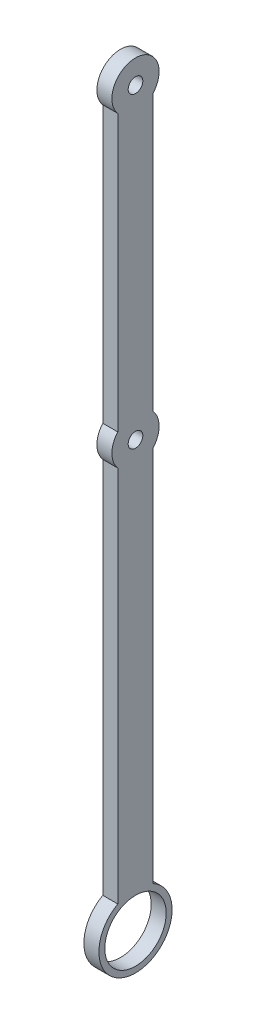
ISO-10303-21;
HEADER;
FILE_DESCRIPTION(('STEP AP214'),'2;1');
FILE_NAME('part.step','',(''),(''),'','','');
FILE_SCHEMA(('AUTOMOTIVE_DESIGN { 1 0 10303 214 1 1 1 1 }'));
ENDSEC;
DATA;
#1=APPLICATION_CONTEXT('core data for automotive mechanical design processes');
#2=APPLICATION_PROTOCOL_DEFINITION('international standard','automotive_design',2000,#1);
#3=PRODUCT_CONTEXT('',#1,'mechanical');
#4=PRODUCT('Part','Part','',(#3));
#5=PRODUCT_RELATED_PRODUCT_CATEGORY('part','',(#4));
#6=PRODUCT_DEFINITION_FORMATION('','',#4);
#7=PRODUCT_DEFINITION_CONTEXT('part definition',#1,'design');
#8=PRODUCT_DEFINITION('design','',#6,#7);
#9=PRODUCT_DEFINITION_SHAPE('','',#8);
#10=(LENGTH_UNIT() NAMED_UNIT(*) SI_UNIT(.MILLI.,.METRE.));
#11=(NAMED_UNIT(*) PLANE_ANGLE_UNIT() SI_UNIT($,.RADIAN.));
#12=(NAMED_UNIT(*) SI_UNIT($,.STERADIAN.) SOLID_ANGLE_UNIT());
#13=UNCERTAINTY_MEASURE_WITH_UNIT(LENGTH_MEASURE(1.E-05),#10,'distance_accuracy_value','');
#14=(GEOMETRIC_REPRESENTATION_CONTEXT(3) GLOBAL_UNCERTAINTY_ASSIGNED_CONTEXT((#13)) GLOBAL_UNIT_ASSIGNED_CONTEXT((#10,
#11,#12)) REPRESENTATION_CONTEXT('',''));
#15=CARTESIAN_POINT('',(0.,0.,0.));
#16=DIRECTION('',(0.,0.,1.));
#17=DIRECTION('',(1.,0.,0.));
#18=AXIS2_PLACEMENT_3D('',#15,#16,#17);
#19=CARTESIAN_POINT('',(3.175,-65.,0.));
#20=DIRECTION('',(1.,0.,0.));
#21=DIRECTION('',(0.,0.,-1.));
#22=AXIS2_PLACEMENT_3D('',#19,#20,#21);
#23=PLANE('',#22);
#24=CARTESIAN_POINT('',(3.175,-65.,0.));
#25=DIRECTION('',(1.,0.,0.));
#26=DIRECTION('',(0.,0.,-1.));
#27=AXIS2_PLACEMENT_3D('',#24,#25,#26);
#28=CIRCLE('',#27,1.55000000000003);
#29=CARTESIAN_POINT('',(3.175,-65.,-1.55000000000003));
#30=VERTEX_POINT('',#29);
#31=EDGE_CURVE('E213',#30,#30,#28,.T.);
#32=ORIENTED_EDGE('',*,*,#31,.F.);
#33=EDGE_LOOP('',(#32));
#34=FACE_BOUND('',#33,.T.);
#35=CARTESIAN_POINT('',(3.175,-65.,0.));
#36=DIRECTION('',(1.,0.,0.));
#37=DIRECTION('',(0.,0.,-1.));
#38=AXIS2_PLACEMENT_3D('',#35,#36,#37);
#39=CIRCLE('',#38,5.);
#40=CARTESIAN_POINT('',(3.175,-61.6928108611693,3.75000000000001));
#41=VERTEX_POINT('',#40);
#42=CARTESIAN_POINT('',(3.175,-68.3071891388307,3.75000000000001));
#43=VERTEX_POINT('',#42);
#44=EDGE_CURVE('E164',#41,#43,#39,.T.);
#45=ORIENTED_EDGE('',*,*,#44,.T.);
#46=DIRECTION('',(0.,-1.,0.));
#47=VECTOR('',#46,1.);
#48=CARTESIAN_POINT('',(3.175,-68.3071891388307,3.75000000000001));
#49=LINE('',#48,#47);
#50=CARTESIAN_POINT('',(3.175,-148.217670016875,3.75000000000001));
#51=VERTEX_POINT('',#50);
#52=EDGE_CURVE('E100',#43,#51,#49,.T.);
#53=ORIENTED_EDGE('',*,*,#52,.T.);
#54=CARTESIAN_POINT('',(3.175,-155.,0.));
#55=DIRECTION('',(1.,0.,0.));
#56=DIRECTION('',(0.,0.,-1.));
#57=AXIS2_PLACEMENT_3D('',#54,#55,#56);
#58=CIRCLE('',#57,7.75);
#59=CARTESIAN_POINT('',(3.175,-148.217670016875,-3.75000000000001));
#60=VERTEX_POINT('',#59);
#61=EDGE_CURVE('E185',#51,#60,#58,.T.);
#62=ORIENTED_EDGE('',*,*,#61,.T.);
#63=DIRECTION('',(0.,1.,0.));
#64=VECTOR('',#63,1.);
#65=CARTESIAN_POINT('',(3.175,-68.3071891388307,-3.75000000000001));
#66=LINE('',#65,#64);
#67=CARTESIAN_POINT('',(3.175,-68.3071891388307,-3.75));
#68=VERTEX_POINT('',#67);
#69=EDGE_CURVE('E199',#60,#68,#66,.T.);
#70=ORIENTED_EDGE('',*,*,#69,.T.);
#71=CARTESIAN_POINT('',(3.175,-65.,0.));
#72=DIRECTION('',(1.,0.,0.));
#73=DIRECTION('',(0.,0.,-1.));
#74=AXIS2_PLACEMENT_3D('',#71,#72,#73);
#75=CIRCLE('',#74,5.);
#76=CARTESIAN_POINT('',(3.175,-61.6928108611693,-3.75000000000001));
#77=VERTEX_POINT('',#76);
#78=EDGE_CURVE('E119',#68,#77,#75,.T.);
#79=ORIENTED_EDGE('',*,*,#78,.T.);
#80=DIRECTION('',(0.,1.,0.));
#81=VECTOR('',#80,1.);
#82=CARTESIAN_POINT('',(3.175,-3.30718913883074,-3.75));
#83=LINE('',#82,#81);
#84=CARTESIAN_POINT('',(3.175,-3.30718913883074,-3.75));
#85=VERTEX_POINT('',#84);
#86=EDGE_CURVE('E113',#77,#85,#83,.T.);
#87=ORIENTED_EDGE('',*,*,#86,.T.);
#88=CARTESIAN_POINT('',(3.175,0.,0.));
#89=DIRECTION('',(1.,0.,0.));
#90=DIRECTION('',(0.,0.,-1.));
#91=AXIS2_PLACEMENT_3D('',#88,#89,#90);
#92=CIRCLE('',#91,5.);
#93=CARTESIAN_POINT('',(3.175,-3.30718913883074,3.75));
#94=VERTEX_POINT('',#93);
#95=EDGE_CURVE('E117',#85,#94,#92,.T.);
#96=ORIENTED_EDGE('',*,*,#95,.T.);
#97=DIRECTION('',(0.,-1.,0.));
#98=VECTOR('',#97,1.);
#99=CARTESIAN_POINT('',(3.175,-3.30718913883074,3.75));
#100=LINE('',#99,#98);
#101=EDGE_CURVE('E57',#94,#41,#100,.T.);
#102=ORIENTED_EDGE('',*,*,#101,.T.);
#103=EDGE_LOOP('',(#45,#53,#62,#70,#79,#87,#96,#102));
#104=FACE_BOUND('',#103,.T.);
#105=CARTESIAN_POINT('',(3.175,0.,0.));
#106=DIRECTION('',(1.,0.,0.));
#107=DIRECTION('',(0.,0.,-1.));
#108=AXIS2_PLACEMENT_3D('',#105,#106,#107);
#109=CIRCLE('',#108,1.55);
#110=CARTESIAN_POINT('',(3.175,0.,-1.55));
#111=VERTEX_POINT('',#110);
#112=EDGE_CURVE('E146',#111,#111,#109,.T.);
#113=ORIENTED_EDGE('',*,*,#112,.F.);
#114=EDGE_LOOP('',(#113));
#115=FACE_BOUND('',#114,.T.);
#116=CARTESIAN_POINT('',(3.175,-155.,0.));
#117=DIRECTION('',(1.,0.,0.));
#118=DIRECTION('',(0.,0.,-1.));
#119=AXIS2_PLACEMENT_3D('',#116,#117,#118);
#120=CIRCLE('',#119,6.5);
#121=CARTESIAN_POINT('',(3.175,-155.,-6.50000000000001));
#122=VERTEX_POINT('',#121);
#123=EDGE_CURVE('E221',#122,#122,#120,.T.);
#124=ORIENTED_EDGE('',*,*,#123,.F.);
#125=EDGE_LOOP('',(#124));
#126=FACE_BOUND('',#125,.T.);
#127=ADVANCED_FACE('F39',(#34,#104,#115,#126),#23,.T.);
#128=CARTESIAN_POINT('',(0.,-65.,0.));
#129=DIRECTION('',(1.,0.,0.));
#130=DIRECTION('',(0.,0.,-1.));
#131=AXIS2_PLACEMENT_3D('',#128,#129,#130);
#132=PLANE('',#131);
#133=CARTESIAN_POINT('',(0.,-65.,0.));
#134=DIRECTION('',(1.,0.,0.));
#135=DIRECTION('',(0.,0.,-1.));
#136=AXIS2_PLACEMENT_3D('',#133,#134,#135);
#137=CIRCLE('',#136,5.);
#138=CARTESIAN_POINT('',(0.,-61.6928108611693,3.75000000000001));
#139=VERTEX_POINT('',#138);
#140=CARTESIAN_POINT('',(0.,-68.3071891388307,3.75000000000001));
#141=VERTEX_POINT('',#140);
#142=EDGE_CURVE('E141',#139,#141,#137,.T.);
#143=ORIENTED_EDGE('',*,*,#142,.F.);
#144=DIRECTION('',(0.,-1.,0.));
#145=VECTOR('',#144,1.);
#146=CARTESIAN_POINT('',(0.,-3.30718913883074,3.75));
#147=LINE('',#146,#145);
#148=CARTESIAN_POINT('',(0.,-3.30718913883074,3.75));
#149=VERTEX_POINT('',#148);
#150=EDGE_CURVE('E92',#149,#139,#147,.T.);
#151=ORIENTED_EDGE('',*,*,#150,.F.);
#152=CARTESIAN_POINT('',(0.,0.,0.));
#153=DIRECTION('',(1.,0.,0.));
#154=DIRECTION('',(0.,0.,-1.));
#155=AXIS2_PLACEMENT_3D('',#152,#153,#154);
#156=CIRCLE('',#155,5.);
#157=CARTESIAN_POINT('',(0.,-3.30718913883074,-3.75));
#158=VERTEX_POINT('',#157);
#159=EDGE_CURVE('E86',#158,#149,#156,.T.);
#160=ORIENTED_EDGE('',*,*,#159,.F.);
#161=DIRECTION('',(0.,1.,0.));
#162=VECTOR('',#161,1.);
#163=CARTESIAN_POINT('',(0.,-3.30718913883074,-3.75));
#164=LINE('',#163,#162);
#165=CARTESIAN_POINT('',(0.,-61.6928108611693,-3.75000000000001));
#166=VERTEX_POINT('',#165);
#167=EDGE_CURVE('E128',#166,#158,#164,.T.);
#168=ORIENTED_EDGE('',*,*,#167,.F.);
#169=CARTESIAN_POINT('',(0.,-65.,0.));
#170=DIRECTION('',(1.,0.,0.));
#171=DIRECTION('',(0.,0.,-1.));
#172=AXIS2_PLACEMENT_3D('',#169,#170,#171);
#173=CIRCLE('',#172,5.);
#174=CARTESIAN_POINT('',(0.,-68.3071891388307,-3.75));
#175=VERTEX_POINT('',#174);
#176=EDGE_CURVE('E155',#175,#166,#173,.T.);
#177=ORIENTED_EDGE('',*,*,#176,.F.);
#178=DIRECTION('',(0.,1.,0.));
#179=VECTOR('',#178,1.);
#180=CARTESIAN_POINT('',(0.,-68.3071891388307,-3.75000000000001));
#181=LINE('',#180,#179);
#182=CARTESIAN_POINT('',(0.,-148.217670016875,-3.75000000000001));
#183=VERTEX_POINT('',#182);
#184=EDGE_CURVE('E152',#183,#175,#181,.T.);
#185=ORIENTED_EDGE('',*,*,#184,.F.);
#186=CARTESIAN_POINT('',(0.,-155.,0.));
#187=DIRECTION('',(1.,0.,0.));
#188=DIRECTION('',(0.,0.,-1.));
#189=AXIS2_PLACEMENT_3D('',#186,#187,#188);
#190=CIRCLE('',#189,7.75);
#191=CARTESIAN_POINT('',(0.,-148.217670016875,3.75000000000001));
#192=VERTEX_POINT('',#191);
#193=EDGE_CURVE('E149',#192,#183,#190,.T.);
#194=ORIENTED_EDGE('',*,*,#193,.F.);
#195=DIRECTION('',(0.,-1.,0.));
#196=VECTOR('',#195,1.);
#197=CARTESIAN_POINT('',(0.,-68.3071891388307,3.75000000000001));
#198=LINE('',#197,#196);
#199=EDGE_CURVE('E145',#141,#192,#198,.T.);
#200=ORIENTED_EDGE('',*,*,#199,.F.);
#201=EDGE_LOOP('',(#143,#151,#160,#168,#177,#185,#194,#200));
#202=FACE_BOUND('',#201,.T.);
#203=CARTESIAN_POINT('',(0.,0.,0.));
#204=DIRECTION('',(1.,0.,0.));
#205=DIRECTION('',(0.,0.,-1.));
#206=AXIS2_PLACEMENT_3D('',#203,#204,#205);
#207=CIRCLE('',#206,1.55);
#208=CARTESIAN_POINT('',(0.,0.,-1.55));
#209=VERTEX_POINT('',#208);
#210=EDGE_CURVE('E209',#209,#209,#207,.T.);
#211=ORIENTED_EDGE('',*,*,#210,.T.);
#212=EDGE_LOOP('',(#211));
#213=FACE_BOUND('',#212,.T.);
#214=CARTESIAN_POINT('',(0.,-65.,0.));
#215=DIRECTION('',(1.,0.,0.));
#216=DIRECTION('',(0.,0.,-1.));
#217=AXIS2_PLACEMENT_3D('',#214,#215,#216);
#218=CIRCLE('',#217,1.55000000000003);
#219=CARTESIAN_POINT('',(0.,-65.,-1.55000000000003));
#220=VERTEX_POINT('',#219);
#221=EDGE_CURVE('E217',#220,#220,#218,.T.);
#222=ORIENTED_EDGE('',*,*,#221,.T.);
#223=EDGE_LOOP('',(#222));
#224=FACE_BOUND('',#223,.T.);
#225=CARTESIAN_POINT('',(0.,-155.,0.));
#226=DIRECTION('',(1.,0.,0.));
#227=DIRECTION('',(0.,0.,-1.));
#228=AXIS2_PLACEMENT_3D('',#225,#226,#227);
#229=CIRCLE('',#228,6.5);
#230=CARTESIAN_POINT('',(0.,-155.,-6.50000000000001));
#231=VERTEX_POINT('',#230);
#232=EDGE_CURVE('E225',#231,#231,#229,.T.);
#233=ORIENTED_EDGE('',*,*,#232,.T.);
#234=EDGE_LOOP('',(#233));
#235=FACE_BOUND('',#234,.T.);
#236=ADVANCED_FACE('F189',(#202,#213,#224,#235),#132,.F.);
#237=CARTESIAN_POINT('',(3.175,-65.,0.));
#238=DIRECTION('',(-1.,0.,0.));
#239=DIRECTION('',(0.,0.,1.));
#240=AXIS2_PLACEMENT_3D('',#237,#238,#239);
#241=CYLINDRICAL_SURFACE('',#240,5.);
#242=ORIENTED_EDGE('',*,*,#142,.T.);
#243=DIRECTION('',(-1.,0.,0.));
#244=VECTOR('',#243,1.);
#245=CARTESIAN_POINT('',(3.175,-68.3071891388307,3.75000000000001));
#246=LINE('',#245,#244);
#247=EDGE_CURVE('E11',#43,#141,#246,.T.);
#248=ORIENTED_EDGE('',*,*,#247,.F.);
#249=ORIENTED_EDGE('',*,*,#44,.F.);
#250=DIRECTION('',(-1.,0.,0.));
#251=VECTOR('',#250,1.);
#252=CARTESIAN_POINT('',(3.175,-61.6928108611693,3.75000000000001));
#253=LINE('',#252,#251);
#254=EDGE_CURVE('E137',#41,#139,#253,.T.);
#255=ORIENTED_EDGE('',*,*,#254,.T.);
#256=EDGE_LOOP('',(#242,#248,#249,#255));
#257=FACE_BOUND('',#256,.T.);
#258=ADVANCED_FACE('F41',(#257),#241,.T.);
#259=CARTESIAN_POINT('',(3.175,-68.3071891388307,3.75000000000001));
#260=DIRECTION('',(0.,0.,-1.));
#261=DIRECTION('',(0.,1.,0.));
#262=AXIS2_PLACEMENT_3D('',#259,#260,#261);
#263=PLANE('',#262);
#264=ORIENTED_EDGE('',*,*,#199,.T.);
#265=DIRECTION('',(-1.,0.,0.));
#266=VECTOR('',#265,1.);
#267=CARTESIAN_POINT('',(3.175,-148.217670016875,3.75000000000001));
#268=LINE('',#267,#266);
#269=EDGE_CURVE('E49',#51,#192,#268,.T.);
#270=ORIENTED_EDGE('',*,*,#269,.F.);
#271=ORIENTED_EDGE('',*,*,#52,.F.);
#272=ORIENTED_EDGE('',*,*,#247,.T.);
#273=EDGE_LOOP('',(#264,#270,#271,#272));
#274=FACE_BOUND('',#273,.T.);
#275=ADVANCED_FACE('F260',(#274),#263,.F.);
#276=CARTESIAN_POINT('',(3.175,-155.,0.));
#277=DIRECTION('',(-1.,0.,0.));
#278=DIRECTION('',(0.,0.,1.));
#279=AXIS2_PLACEMENT_3D('',#276,#277,#278);
#280=CYLINDRICAL_SURFACE('',#279,7.75);
#281=ORIENTED_EDGE('',*,*,#193,.T.);
#282=DIRECTION('',(-1.,0.,0.));
#283=VECTOR('',#282,1.);
#284=CARTESIAN_POINT('',(3.175,-148.217670016875,-3.75000000000001));
#285=LINE('',#284,#283);
#286=EDGE_CURVE('E175',#60,#183,#285,.T.);
#287=ORIENTED_EDGE('',*,*,#286,.F.);
#288=ORIENTED_EDGE('',*,*,#61,.F.);
#289=ORIENTED_EDGE('',*,*,#269,.T.);
#290=EDGE_LOOP('',(#281,#287,#288,#289));
#291=FACE_BOUND('',#290,.T.);
#292=ADVANCED_FACE('F183',(#291),#280,.T.);
#293=CARTESIAN_POINT('',(3.175,-68.3071891388307,-3.75000000000001));
#294=DIRECTION('',(0.,0.,1.));
#295=DIRECTION('',(0.,-1.,0.));
#296=AXIS2_PLACEMENT_3D('',#293,#294,#295);
#297=PLANE('',#296);
#298=ORIENTED_EDGE('',*,*,#184,.T.);
#299=DIRECTION('',(-1.,0.,0.));
#300=VECTOR('',#299,1.);
#301=CARTESIAN_POINT('',(3.175,-68.3071891388307,-3.75));
#302=LINE('',#301,#300);
#303=EDGE_CURVE('E171',#68,#175,#302,.T.);
#304=ORIENTED_EDGE('',*,*,#303,.F.);
#305=ORIENTED_EDGE('',*,*,#69,.F.);
#306=ORIENTED_EDGE('',*,*,#286,.T.);
#307=EDGE_LOOP('',(#298,#304,#305,#306));
#308=FACE_BOUND('',#307,.T.);
#309=ADVANCED_FACE('F194',(#308),#297,.F.);
#310=CARTESIAN_POINT('',(3.175,-65.,0.));
#311=DIRECTION('',(-1.,0.,0.));
#312=DIRECTION('',(0.,0.,1.));
#313=AXIS2_PLACEMENT_3D('',#310,#311,#312);
#314=CYLINDRICAL_SURFACE('',#313,5.);
#315=ORIENTED_EDGE('',*,*,#176,.T.);
#316=DIRECTION('',(-1.,0.,0.));
#317=VECTOR('',#316,1.);
#318=CARTESIAN_POINT('',(3.175,-61.6928108611693,-3.75000000000001));
#319=LINE('',#318,#317);
#320=EDGE_CURVE('E130',#77,#166,#319,.T.);
#321=ORIENTED_EDGE('',*,*,#320,.F.);
#322=ORIENTED_EDGE('',*,*,#78,.F.);
#323=ORIENTED_EDGE('',*,*,#303,.T.);
#324=EDGE_LOOP('',(#315,#321,#322,#323));
#325=FACE_BOUND('',#324,.T.);
#326=ADVANCED_FACE('F197',(#325),#314,.T.);
#327=CARTESIAN_POINT('',(3.175,-3.30718913883074,-3.75));
#328=DIRECTION('',(0.,0.,1.));
#329=DIRECTION('',(0.,-1.,0.));
#330=AXIS2_PLACEMENT_3D('',#327,#328,#329);
#331=PLANE('',#330);
#332=ORIENTED_EDGE('',*,*,#167,.T.);
#333=DIRECTION('',(-1.,0.,0.));
#334=VECTOR('',#333,1.);
#335=CARTESIAN_POINT('',(3.175,-3.30718913883074,-3.75));
#336=LINE('',#335,#334);
#337=EDGE_CURVE('E125',#85,#158,#336,.T.);
#338=ORIENTED_EDGE('',*,*,#337,.F.);
#339=ORIENTED_EDGE('',*,*,#86,.F.);
#340=ORIENTED_EDGE('',*,*,#320,.T.);
#341=EDGE_LOOP('',(#332,#338,#339,#340));
#342=FACE_BOUND('',#341,.T.);
#343=ADVANCED_FACE('F126',(#342),#331,.F.);
#344=CARTESIAN_POINT('',(3.175,0.,0.));
#345=DIRECTION('',(-1.,0.,0.));
#346=DIRECTION('',(0.,0.,1.));
#347=AXIS2_PLACEMENT_3D('',#344,#345,#346);
#348=CYLINDRICAL_SURFACE('',#347,5.);
#349=ORIENTED_EDGE('',*,*,#159,.T.);
#350=DIRECTION('',(-1.,0.,0.));
#351=VECTOR('',#350,1.);
#352=CARTESIAN_POINT('',(3.175,-3.30718913883074,3.75));
#353=LINE('',#352,#351);
#354=EDGE_CURVE('E131',#94,#149,#353,.T.);
#355=ORIENTED_EDGE('',*,*,#354,.F.);
#356=ORIENTED_EDGE('',*,*,#95,.F.);
#357=ORIENTED_EDGE('',*,*,#337,.T.);
#358=EDGE_LOOP('',(#349,#355,#356,#357));
#359=FACE_BOUND('',#358,.T.);
#360=ADVANCED_FACE('F133',(#359),#348,.T.);
#361=CARTESIAN_POINT('',(3.175,-3.30718913883074,3.75));
#362=DIRECTION('',(0.,0.,-1.));
#363=DIRECTION('',(0.,1.,0.));
#364=AXIS2_PLACEMENT_3D('',#361,#362,#363);
#365=PLANE('',#364);
#366=ORIENTED_EDGE('',*,*,#150,.T.);
#367=ORIENTED_EDGE('',*,*,#254,.F.);
#368=ORIENTED_EDGE('',*,*,#101,.F.);
#369=ORIENTED_EDGE('',*,*,#354,.T.);
#370=EDGE_LOOP('',(#366,#367,#368,#369));
#371=FACE_BOUND('',#370,.T.);
#372=ADVANCED_FACE('F248',(#371),#365,.F.);
#373=CARTESIAN_POINT('',(3.175,0.,0.));
#374=DIRECTION('',(-1.,0.,0.));
#375=DIRECTION('',(0.,0.,1.));
#376=AXIS2_PLACEMENT_3D('',#373,#374,#375);
#377=CYLINDRICAL_SURFACE('',#376,1.55);
#378=ORIENTED_EDGE('',*,*,#112,.T.);
#379=EDGE_LOOP('',(#378));
#380=FACE_BOUND('',#379,.T.);
#381=ORIENTED_EDGE('',*,*,#210,.F.);
#382=EDGE_LOOP('',(#381));
#383=FACE_BOUND('',#382,.T.);
#384=ADVANCED_FACE('F245',(#380,#383),#377,.F.);
#385=CARTESIAN_POINT('',(3.175,-65.,0.));
#386=DIRECTION('',(-1.,0.,0.));
#387=DIRECTION('',(0.,0.,1.));
#388=AXIS2_PLACEMENT_3D('',#385,#386,#387);
#389=CYLINDRICAL_SURFACE('',#388,1.55000000000003);
#390=ORIENTED_EDGE('',*,*,#31,.T.);
#391=EDGE_LOOP('',(#390));
#392=FACE_BOUND('',#391,.T.);
#393=ORIENTED_EDGE('',*,*,#221,.F.);
#394=EDGE_LOOP('',(#393));
#395=FACE_BOUND('',#394,.T.);
#396=ADVANCED_FACE('F324',(#392,#395),#389,.F.);
#397=CARTESIAN_POINT('',(3.175,-155.,0.));
#398=DIRECTION('',(-1.,0.,0.));
#399=DIRECTION('',(0.,0.,1.));
#400=AXIS2_PLACEMENT_3D('',#397,#398,#399);
#401=CYLINDRICAL_SURFACE('',#400,6.5);
#402=ORIENTED_EDGE('',*,*,#123,.T.);
#403=EDGE_LOOP('',(#402));
#404=FACE_BOUND('',#403,.T.);
#405=ORIENTED_EDGE('',*,*,#232,.F.);
#406=EDGE_LOOP('',(#405));
#407=FACE_BOUND('',#406,.T.);
#408=ADVANCED_FACE('F233',(#404,#407),#401,.F.);
#409=CLOSED_SHELL('',(#127,#236,#258,#275,#292,#309,#326,#343,#360,#372,#384,#396,#408));
#410=MANIFOLD_SOLID_BREP('B2',#409);
#411=ADVANCED_BREP_SHAPE_REPRESENTATION('',(#18,#410),#14);
#412=SHAPE_DEFINITION_REPRESENTATION(#9,#411);
ENDSEC;
END-ISO-10303-21;
